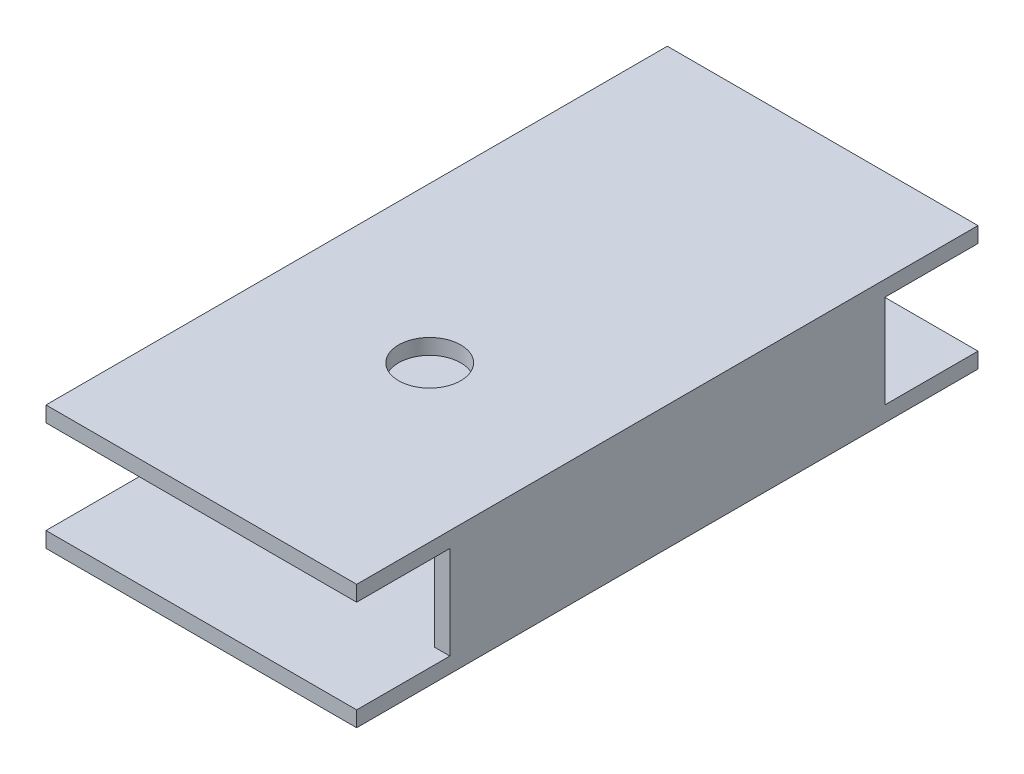
ISO-10303-21;
HEADER;
FILE_DESCRIPTION(('STEP AP214'),'2;1');
FILE_NAME('part.step','',(''),(''),'','','');
FILE_SCHEMA(('AUTOMOTIVE_DESIGN { 1 0 10303 214 1 1 1 1 }'));
ENDSEC;
DATA;
#1=APPLICATION_CONTEXT('core data for automotive mechanical design processes');
#2=APPLICATION_PROTOCOL_DEFINITION('international standard','automotive_design',2000,#1);
#3=PRODUCT_CONTEXT('',#1,'mechanical');
#4=PRODUCT('Part','Part','',(#3));
#5=PRODUCT_RELATED_PRODUCT_CATEGORY('part','',(#4));
#6=PRODUCT_DEFINITION_FORMATION('','',#4);
#7=PRODUCT_DEFINITION_CONTEXT('part definition',#1,'design');
#8=PRODUCT_DEFINITION('design','',#6,#7);
#9=PRODUCT_DEFINITION_SHAPE('','',#8);
#10=(LENGTH_UNIT() NAMED_UNIT(*) SI_UNIT(.MILLI.,.METRE.));
#11=(NAMED_UNIT(*) PLANE_ANGLE_UNIT() SI_UNIT($,.RADIAN.));
#12=(NAMED_UNIT(*) SI_UNIT($,.STERADIAN.) SOLID_ANGLE_UNIT());
#13=UNCERTAINTY_MEASURE_WITH_UNIT(LENGTH_MEASURE(1.E-05),#10,'distance_accuracy_value','');
#14=(GEOMETRIC_REPRESENTATION_CONTEXT(3) GLOBAL_UNCERTAINTY_ASSIGNED_CONTEXT((#13)) GLOBAL_UNIT_ASSIGNED_CONTEXT((#10,
#11,#12)) REPRESENTATION_CONTEXT('',''));
#15=CARTESIAN_POINT('',(0.,0.,0.));
#16=DIRECTION('',(0.,0.,1.));
#17=DIRECTION('',(1.,0.,0.));
#18=AXIS2_PLACEMENT_3D('',#15,#16,#17);
#19=CARTESIAN_POINT('',(0.,0.,127.));
#20=DIRECTION('',(0.,0.,1.));
#21=DIRECTION('',(1.,0.,0.));
#22=AXIS2_PLACEMENT_3D('',#19,#20,#21);
#23=PLANE('',#22);
#24=DIRECTION('',(-1.,0.,0.));
#25=VECTOR('',#24,1.);
#26=CARTESIAN_POINT('',(0.,22.225,127.));
#27=LINE('',#26,#25);
#28=CARTESIAN_POINT('',(63.5,22.225,127.));
#29=VERTEX_POINT('',#28);
#30=CARTESIAN_POINT('',(0.,22.225,127.));
#31=VERTEX_POINT('',#30);
#32=EDGE_CURVE('E180',#29,#31,#27,.T.);
#33=ORIENTED_EDGE('',*,*,#32,.F.);
#34=DIRECTION('',(0.,1.,0.));
#35=VECTOR('',#34,1.);
#36=CARTESIAN_POINT('',(63.5,0.,127.));
#37=LINE('',#36,#35);
#38=CARTESIAN_POINT('',(63.5,25.4,127.));
#39=VERTEX_POINT('',#38);
#40=EDGE_CURVE('E207',#29,#39,#37,.T.);
#41=ORIENTED_EDGE('',*,*,#40,.T.);
#42=DIRECTION('',(-1.,0.,0.));
#43=VECTOR('',#42,1.);
#44=CARTESIAN_POINT('',(0.,25.4,127.));
#45=LINE('',#44,#43);
#46=CARTESIAN_POINT('',(0.,25.4,127.));
#47=VERTEX_POINT('',#46);
#48=EDGE_CURVE('E209',#39,#47,#45,.T.);
#49=ORIENTED_EDGE('',*,*,#48,.T.);
#50=DIRECTION('',(0.,-1.,0.));
#51=VECTOR('',#50,1.);
#52=CARTESIAN_POINT('',(0.,0.,127.));
#53=LINE('',#52,#51);
#54=EDGE_CURVE('E195',#47,#31,#53,.T.);
#55=ORIENTED_EDGE('',*,*,#54,.T.);
#56=EDGE_LOOP('',(#33,#41,#49,#55));
#57=FACE_BOUND('',#56,.T.);
#58=ADVANCED_FACE('F56',(#57),#23,.T.);
#59=CARTESIAN_POINT('',(0.,0.,0.));
#60=DIRECTION('',(0.,0.,1.));
#61=DIRECTION('',(1.,0.,0.));
#62=AXIS2_PLACEMENT_3D('',#59,#60,#61);
#63=PLANE('',#62);
#64=DIRECTION('',(0.,-1.,0.));
#65=VECTOR('',#64,1.);
#66=CARTESIAN_POINT('',(0.,0.,0.));
#67=LINE('',#66,#65);
#68=CARTESIAN_POINT('',(0.,3.175,0.));
#69=VERTEX_POINT('',#68);
#70=CARTESIAN_POINT('',(0.,0.,0.));
#71=VERTEX_POINT('',#70);
#72=EDGE_CURVE('E216',#69,#71,#67,.T.);
#73=ORIENTED_EDGE('',*,*,#72,.F.);
#74=DIRECTION('',(1.,0.,0.));
#75=VECTOR('',#74,1.);
#76=CARTESIAN_POINT('',(0.,3.175,0.));
#77=LINE('',#76,#75);
#78=CARTESIAN_POINT('',(63.5,3.175,0.));
#79=VERTEX_POINT('',#78);
#80=EDGE_CURVE('E238',#69,#79,#77,.T.);
#81=ORIENTED_EDGE('',*,*,#80,.T.);
#82=DIRECTION('',(0.,1.,0.));
#83=VECTOR('',#82,1.);
#84=CARTESIAN_POINT('',(63.5,0.,0.));
#85=LINE('',#84,#83);
#86=CARTESIAN_POINT('',(63.5,0.,0.));
#87=VERTEX_POINT('',#86);
#88=EDGE_CURVE('E200',#87,#79,#85,.T.);
#89=ORIENTED_EDGE('',*,*,#88,.F.);
#90=DIRECTION('',(1.,0.,0.));
#91=VECTOR('',#90,1.);
#92=CARTESIAN_POINT('',(0.,0.,0.));
#93=LINE('',#92,#91);
#94=EDGE_CURVE('E215',#71,#87,#93,.T.);
#95=ORIENTED_EDGE('',*,*,#94,.F.);
#96=EDGE_LOOP('',(#73,#81,#89,#95));
#97=FACE_BOUND('',#96,.T.);
#98=ADVANCED_FACE('F237',(#97),#63,.F.);
#99=DIRECTION('',(1.,0.,0.));
#100=VECTOR('',#99,1.);
#101=CARTESIAN_POINT('',(0.,3.175,127.));
#102=LINE('',#101,#100);
#103=CARTESIAN_POINT('',(0.,3.175,127.));
#104=VERTEX_POINT('',#103);
#105=CARTESIAN_POINT('',(63.5,3.175,127.));
#106=VERTEX_POINT('',#105);
#107=EDGE_CURVE('E171',#104,#106,#102,.T.);
#108=ORIENTED_EDGE('',*,*,#107,.F.);
#109=CARTESIAN_POINT('',(0.,0.,127.));
#110=VERTEX_POINT('',#109);
#111=EDGE_CURVE('E175',#104,#110,#53,.T.);
#112=ORIENTED_EDGE('',*,*,#111,.T.);
#113=DIRECTION('',(1.,0.,0.));
#114=VECTOR('',#113,1.);
#115=CARTESIAN_POINT('',(0.,0.,127.));
#116=LINE('',#115,#114);
#117=CARTESIAN_POINT('',(63.5,0.,127.));
#118=VERTEX_POINT('',#117);
#119=EDGE_CURVE('E199',#110,#118,#116,.T.);
#120=ORIENTED_EDGE('',*,*,#119,.T.);
#121=EDGE_CURVE('E178',#118,#106,#37,.T.);
#122=ORIENTED_EDGE('',*,*,#121,.T.);
#123=EDGE_LOOP('',(#108,#112,#120,#122));
#124=FACE_BOUND('',#123,.T.);
#125=ADVANCED_FACE('F173',(#124),#23,.T.);
#126=CARTESIAN_POINT('',(63.5,22.225,0.));
#127=VERTEX_POINT('',#126);
#128=CARTESIAN_POINT('',(63.5,25.4,0.));
#129=VERTEX_POINT('',#128);
#130=EDGE_CURVE('E218',#127,#129,#85,.T.);
#131=ORIENTED_EDGE('',*,*,#130,.F.);
#132=DIRECTION('',(-1.,0.,0.));
#133=VECTOR('',#132,1.);
#134=CARTESIAN_POINT('',(0.,22.225,0.));
#135=LINE('',#134,#133);
#136=CARTESIAN_POINT('',(0.,22.225,0.));
#137=VERTEX_POINT('',#136);
#138=EDGE_CURVE('E181',#127,#137,#135,.T.);
#139=ORIENTED_EDGE('',*,*,#138,.T.);
#140=CARTESIAN_POINT('',(0.,25.4,0.));
#141=VERTEX_POINT('',#140);
#142=EDGE_CURVE('E212',#141,#137,#67,.T.);
#143=ORIENTED_EDGE('',*,*,#142,.F.);
#144=DIRECTION('',(-1.,0.,0.));
#145=VECTOR('',#144,1.);
#146=CARTESIAN_POINT('',(0.,25.4,0.));
#147=LINE('',#146,#145);
#148=EDGE_CURVE('E196',#129,#141,#147,.T.);
#149=ORIENTED_EDGE('',*,*,#148,.F.);
#150=EDGE_LOOP('',(#131,#139,#143,#149));
#151=FACE_BOUND('',#150,.T.);
#152=ADVANCED_FACE('F348',(#151),#63,.F.);
#153=CARTESIAN_POINT('',(0.,0.,127.));
#154=DIRECTION('',(1.,0.,0.));
#155=DIRECTION('',(0.,0.,-1.));
#156=AXIS2_PLACEMENT_3D('',#153,#154,#155);
#157=PLANE('',#156);
#158=DIRECTION('',(0.,1.,0.));
#159=VECTOR('',#158,1.);
#160=CARTESIAN_POINT('',(0.,22.225,107.95));
#161=LINE('',#160,#159);
#162=CARTESIAN_POINT('',(0.,3.175,107.95));
#163=VERTEX_POINT('',#162);
#164=CARTESIAN_POINT('',(0.,22.225,107.95));
#165=VERTEX_POINT('',#164);
#166=EDGE_CURVE('E191',#163,#165,#161,.T.);
#167=ORIENTED_EDGE('',*,*,#166,.T.);
#168=DIRECTION('',(0.,0.,1.));
#169=VECTOR('',#168,1.);
#170=CARTESIAN_POINT('',(0.,22.225,127.));
#171=LINE('',#170,#169);
#172=EDGE_CURVE('E307',#165,#31,#171,.T.);
#173=ORIENTED_EDGE('',*,*,#172,.T.);
#174=ORIENTED_EDGE('',*,*,#54,.F.);
#175=DIRECTION('',(0.,0.,-1.));
#176=VECTOR('',#175,1.);
#177=CARTESIAN_POINT('',(0.,25.4,127.));
#178=LINE('',#177,#176);
#179=EDGE_CURVE('E211',#47,#141,#178,.T.);
#180=ORIENTED_EDGE('',*,*,#179,.T.);
#181=ORIENTED_EDGE('',*,*,#142,.T.);
#182=DIRECTION('',(0.,0.,1.));
#183=VECTOR('',#182,1.);
#184=CARTESIAN_POINT('',(0.,22.225,0.));
#185=LINE('',#184,#183);
#186=CARTESIAN_POINT('',(0.,22.225,19.05));
#187=VERTEX_POINT('',#186);
#188=EDGE_CURVE('E249',#137,#187,#185,.T.);
#189=ORIENTED_EDGE('',*,*,#188,.T.);
#190=DIRECTION('',(0.,-1.,0.));
#191=VECTOR('',#190,1.);
#192=CARTESIAN_POINT('',(0.,22.225,19.05));
#193=LINE('',#192,#191);
#194=CARTESIAN_POINT('',(0.,3.175,19.05));
#195=VERTEX_POINT('',#194);
#196=EDGE_CURVE('E253',#187,#195,#193,.T.);
#197=ORIENTED_EDGE('',*,*,#196,.T.);
#198=DIRECTION('',(0.,0.,-1.));
#199=VECTOR('',#198,1.);
#200=CARTESIAN_POINT('',(0.,3.175,0.));
#201=LINE('',#200,#199);
#202=EDGE_CURVE('E281',#195,#69,#201,.T.);
#203=ORIENTED_EDGE('',*,*,#202,.T.);
#204=ORIENTED_EDGE('',*,*,#72,.T.);
#205=DIRECTION('',(0.,0.,-1.));
#206=VECTOR('',#205,1.);
#207=CARTESIAN_POINT('',(0.,0.,127.));
#208=LINE('',#207,#206);
#209=EDGE_CURVE('E12',#110,#71,#208,.T.);
#210=ORIENTED_EDGE('',*,*,#209,.F.);
#211=ORIENTED_EDGE('',*,*,#111,.F.);
#212=DIRECTION('',(0.,0.,-1.));
#213=VECTOR('',#212,1.);
#214=CARTESIAN_POINT('',(0.,3.175,127.));
#215=LINE('',#214,#213);
#216=EDGE_CURVE('E184',#104,#163,#215,.T.);
#217=ORIENTED_EDGE('',*,*,#216,.T.);
#218=EDGE_LOOP('',(#167,#173,#174,#180,#181,#189,#197,#203,#204,#210,#211,#217));
#219=FACE_BOUND('',#218,.T.);
#220=ADVANCED_FACE('F58',(#219),#157,.F.);
#221=CARTESIAN_POINT('',(0.,0.,127.));
#222=DIRECTION('',(0.,1.,0.));
#223=DIRECTION('',(0.,0.,1.));
#224=AXIS2_PLACEMENT_3D('',#221,#222,#223);
#225=PLANE('',#224);
#226=CARTESIAN_POINT('',(31.75,0.,80.3275));
#227=DIRECTION('',(0.,1.,0.));
#228=DIRECTION('',(0.,0.,1.));
#229=AXIS2_PLACEMENT_3D('',#226,#227,#228);
#230=CIRCLE('',#229,6.35);
#231=CARTESIAN_POINT('',(31.75,0.,86.6775));
#232=VERTEX_POINT('',#231);
#233=EDGE_CURVE('E316',#232,#232,#230,.T.);
#234=ORIENTED_EDGE('',*,*,#233,.T.);
#235=EDGE_LOOP('',(#234));
#236=FACE_BOUND('',#235,.T.);
#237=ORIENTED_EDGE('',*,*,#94,.T.);
#238=DIRECTION('',(0.,0.,-1.));
#239=VECTOR('',#238,1.);
#240=CARTESIAN_POINT('',(63.5,0.,127.));
#241=LINE('',#240,#239);
#242=EDGE_CURVE('E65',#118,#87,#241,.T.);
#243=ORIENTED_EDGE('',*,*,#242,.F.);
#244=ORIENTED_EDGE('',*,*,#119,.F.);
#245=ORIENTED_EDGE('',*,*,#209,.T.);
#246=EDGE_LOOP('',(#237,#243,#244,#245));
#247=FACE_BOUND('',#246,.T.);
#248=ADVANCED_FACE('F379',(#236,#247),#225,.F.);
#249=CARTESIAN_POINT('',(63.5,0.,127.));
#250=DIRECTION('',(-1.,0.,0.));
#251=DIRECTION('',(0.,0.,1.));
#252=AXIS2_PLACEMENT_3D('',#249,#250,#251);
#253=PLANE('',#252);
#254=ORIENTED_EDGE('',*,*,#40,.F.);
#255=DIRECTION('',(0.,0.,1.));
#256=VECTOR('',#255,1.);
#257=CARTESIAN_POINT('',(63.5,22.225,127.));
#258=LINE('',#257,#256);
#259=CARTESIAN_POINT('',(63.5,22.225,107.95));
#260=VERTEX_POINT('',#259);
#261=EDGE_CURVE('E192',#260,#29,#258,.T.);
#262=ORIENTED_EDGE('',*,*,#261,.F.);
#263=DIRECTION('',(0.,1.,0.));
#264=VECTOR('',#263,1.);
#265=CARTESIAN_POINT('',(63.5,22.225,107.95));
#266=LINE('',#265,#264);
#267=CARTESIAN_POINT('',(63.5,3.175,107.95));
#268=VERTEX_POINT('',#267);
#269=EDGE_CURVE('E301',#268,#260,#266,.T.);
#270=ORIENTED_EDGE('',*,*,#269,.F.);
#271=DIRECTION('',(0.,0.,-1.));
#272=VECTOR('',#271,1.);
#273=CARTESIAN_POINT('',(63.5,3.175,127.));
#274=LINE('',#273,#272);
#275=EDGE_CURVE('E304',#106,#268,#274,.T.);
#276=ORIENTED_EDGE('',*,*,#275,.F.);
#277=ORIENTED_EDGE('',*,*,#121,.F.);
#278=ORIENTED_EDGE('',*,*,#242,.T.);
#279=ORIENTED_EDGE('',*,*,#88,.T.);
#280=DIRECTION('',(0.,0.,-1.));
#281=VECTOR('',#280,1.);
#282=CARTESIAN_POINT('',(63.5,3.175,0.));
#283=LINE('',#282,#281);
#284=CARTESIAN_POINT('',(63.5,3.175,19.05));
#285=VERTEX_POINT('',#284);
#286=EDGE_CURVE('E244',#285,#79,#283,.T.);
#287=ORIENTED_EDGE('',*,*,#286,.F.);
#288=DIRECTION('',(0.,-1.,0.));
#289=VECTOR('',#288,1.);
#290=CARTESIAN_POINT('',(63.5,22.225,19.05));
#291=LINE('',#290,#289);
#292=CARTESIAN_POINT('',(63.5,22.225,19.05));
#293=VERTEX_POINT('',#292);
#294=EDGE_CURVE('E250',#293,#285,#291,.T.);
#295=ORIENTED_EDGE('',*,*,#294,.F.);
#296=DIRECTION('',(0.,0.,1.));
#297=VECTOR('',#296,1.);
#298=CARTESIAN_POINT('',(63.5,22.225,0.));
#299=LINE('',#298,#297);
#300=EDGE_CURVE('E255',#127,#293,#299,.T.);
#301=ORIENTED_EDGE('',*,*,#300,.F.);
#302=ORIENTED_EDGE('',*,*,#130,.T.);
#303=DIRECTION('',(0.,0.,-1.));
#304=VECTOR('',#303,1.);
#305=CARTESIAN_POINT('',(63.5,25.4,127.));
#306=LINE('',#305,#304);
#307=EDGE_CURVE('E223',#39,#129,#306,.T.);
#308=ORIENTED_EDGE('',*,*,#307,.F.);
#309=EDGE_LOOP('',(#254,#262,#270,#276,#277,#278,#279,#287,#295,#301,#302,#308));
#310=FACE_BOUND('',#309,.T.);
#311=ADVANCED_FACE('F231',(#310),#253,.F.);
#312=CARTESIAN_POINT('',(0.,25.4,127.));
#313=DIRECTION('',(0.,-1.,0.));
#314=DIRECTION('',(0.,0.,-1.));
#315=AXIS2_PLACEMENT_3D('',#312,#313,#314);
#316=PLANE('',#315);
#317=CARTESIAN_POINT('',(31.75,25.4,80.3275));
#318=DIRECTION('',(0.,1.,0.));
#319=DIRECTION('',(0.,0.,1.));
#320=AXIS2_PLACEMENT_3D('',#317,#318,#319);
#321=CIRCLE('',#320,6.35);
#322=CARTESIAN_POINT('',(31.75,25.4,86.6775));
#323=VERTEX_POINT('',#322);
#324=EDGE_CURVE('E313',#323,#323,#321,.T.);
#325=ORIENTED_EDGE('',*,*,#324,.F.);
#326=EDGE_LOOP('',(#325));
#327=FACE_BOUND('',#326,.T.);
#328=ORIENTED_EDGE('',*,*,#148,.T.);
#329=ORIENTED_EDGE('',*,*,#179,.F.);
#330=ORIENTED_EDGE('',*,*,#48,.F.);
#331=ORIENTED_EDGE('',*,*,#307,.T.);
#332=EDGE_LOOP('',(#328,#329,#330,#331));
#333=FACE_BOUND('',#332,.T.);
#334=ADVANCED_FACE('F343',(#327,#333),#316,.F.);
#335=CARTESIAN_POINT('',(3.175,0.,127.));
#336=DIRECTION('',(1.,0.,0.));
#337=DIRECTION('',(0.,0.,-1.));
#338=AXIS2_PLACEMENT_3D('',#335,#336,#337);
#339=PLANE('',#338);
#340=DIRECTION('',(0.,1.,0.));
#341=VECTOR('',#340,1.);
#342=CARTESIAN_POINT('',(3.175,0.,107.95));
#343=LINE('',#342,#341);
#344=CARTESIAN_POINT('',(3.175,3.175,107.95));
#345=VERTEX_POINT('',#344);
#346=CARTESIAN_POINT('',(3.175,22.225,107.95));
#347=VERTEX_POINT('',#346);
#348=EDGE_CURVE('E286',#345,#347,#343,.T.);
#349=ORIENTED_EDGE('',*,*,#348,.F.);
#350=DIRECTION('',(0.,0.,-1.));
#351=VECTOR('',#350,1.);
#352=CARTESIAN_POINT('',(3.175,3.175,127.));
#353=LINE('',#352,#351);
#354=CARTESIAN_POINT('',(3.175,3.175,19.05));
#355=VERTEX_POINT('',#354);
#356=EDGE_CURVE('E204',#345,#355,#353,.T.);
#357=ORIENTED_EDGE('',*,*,#356,.T.);
#358=DIRECTION('',(0.,-1.,0.));
#359=VECTOR('',#358,1.);
#360=CARTESIAN_POINT('',(3.175,0.,19.05));
#361=LINE('',#360,#359);
#362=CARTESIAN_POINT('',(3.175,22.225,19.05));
#363=VERTEX_POINT('',#362);
#364=EDGE_CURVE('E242',#363,#355,#361,.T.);
#365=ORIENTED_EDGE('',*,*,#364,.F.);
#366=DIRECTION('',(0.,0.,-1.));
#367=VECTOR('',#366,1.);
#368=CARTESIAN_POINT('',(3.175,22.225,127.));
#369=LINE('',#368,#367);
#370=EDGE_CURVE('E271',#347,#363,#369,.T.);
#371=ORIENTED_EDGE('',*,*,#370,.F.);
#372=EDGE_LOOP('',(#349,#357,#365,#371));
#373=FACE_BOUND('',#372,.T.);
#374=ADVANCED_FACE('F353',(#373),#339,.T.);
#375=CARTESIAN_POINT('',(0.,3.175,127.));
#376=DIRECTION('',(0.,1.,0.));
#377=DIRECTION('',(0.,0.,1.));
#378=AXIS2_PLACEMENT_3D('',#375,#376,#377);
#379=PLANE('',#378);
#380=CARTESIAN_POINT('',(31.75,3.175,80.3275));
#381=DIRECTION('',(0.,1.,0.));
#382=DIRECTION('',(0.,0.,1.));
#383=AXIS2_PLACEMENT_3D('',#380,#381,#382);
#384=CIRCLE('',#383,6.35);
#385=CARTESIAN_POINT('',(31.75,3.175,86.6775));
#386=VERTEX_POINT('',#385);
#387=EDGE_CURVE('E306',#386,#386,#384,.T.);
#388=ORIENTED_EDGE('',*,*,#387,.F.);
#389=EDGE_LOOP('',(#388));
#390=FACE_BOUND('',#389,.T.);
#391=ORIENTED_EDGE('',*,*,#356,.F.);
#392=DIRECTION('',(1.,0.,0.));
#393=VECTOR('',#392,1.);
#394=CARTESIAN_POINT('',(0.,3.175,107.95));
#395=LINE('',#394,#393);
#396=EDGE_CURVE('E187',#163,#345,#395,.T.);
#397=ORIENTED_EDGE('',*,*,#396,.F.);
#398=ORIENTED_EDGE('',*,*,#216,.F.);
#399=ORIENTED_EDGE('',*,*,#107,.T.);
#400=ORIENTED_EDGE('',*,*,#275,.T.);
#401=CARTESIAN_POINT('',(60.325,3.175,107.95));
#402=VERTEX_POINT('',#401);
#403=EDGE_CURVE('E72',#402,#268,#395,.T.);
#404=ORIENTED_EDGE('',*,*,#403,.F.);
#405=DIRECTION('',(0.,0.,-1.));
#406=VECTOR('',#405,1.);
#407=CARTESIAN_POINT('',(60.325,3.175,127.));
#408=LINE('',#407,#406);
#409=CARTESIAN_POINT('',(60.325,3.175,19.05));
#410=VERTEX_POINT('',#409);
#411=EDGE_CURVE('E275',#402,#410,#408,.T.);
#412=ORIENTED_EDGE('',*,*,#411,.T.);
#413=DIRECTION('',(1.,0.,0.));
#414=VECTOR('',#413,1.);
#415=CARTESIAN_POINT('',(0.,3.175,19.05));
#416=LINE('',#415,#414);
#417=EDGE_CURVE('E246',#410,#285,#416,.T.);
#418=ORIENTED_EDGE('',*,*,#417,.T.);
#419=ORIENTED_EDGE('',*,*,#286,.T.);
#420=ORIENTED_EDGE('',*,*,#80,.F.);
#421=ORIENTED_EDGE('',*,*,#202,.F.);
#422=EDGE_CURVE('E259',#195,#355,#416,.T.);
#423=ORIENTED_EDGE('',*,*,#422,.T.);
#424=EDGE_LOOP('',(#391,#397,#398,#399,#400,#404,#412,#418,#419,#420,#421,#423));
#425=FACE_BOUND('',#424,.T.);
#426=ADVANCED_FACE('F186',(#390,#425),#379,.T.);
#427=CARTESIAN_POINT('',(60.325,0.,127.));
#428=DIRECTION('',(-1.,0.,0.));
#429=DIRECTION('',(0.,0.,1.));
#430=AXIS2_PLACEMENT_3D('',#427,#428,#429);
#431=PLANE('',#430);
#432=DIRECTION('',(0.,-1.,0.));
#433=VECTOR('',#432,1.);
#434=CARTESIAN_POINT('',(60.325,0.,107.95));
#435=LINE('',#434,#433);
#436=CARTESIAN_POINT('',(60.325,22.225,107.95));
#437=VERTEX_POINT('',#436);
#438=EDGE_CURVE('E289',#437,#402,#435,.T.);
#439=ORIENTED_EDGE('',*,*,#438,.F.);
#440=DIRECTION('',(0.,0.,-1.));
#441=VECTOR('',#440,1.);
#442=CARTESIAN_POINT('',(60.325,22.225,127.));
#443=LINE('',#442,#441);
#444=CARTESIAN_POINT('',(60.325,22.225,19.05));
#445=VERTEX_POINT('',#444);
#446=EDGE_CURVE('E80',#437,#445,#443,.T.);
#447=ORIENTED_EDGE('',*,*,#446,.T.);
#448=DIRECTION('',(0.,1.,0.));
#449=VECTOR('',#448,1.);
#450=CARTESIAN_POINT('',(60.325,0.,19.05));
#451=LINE('',#450,#449);
#452=EDGE_CURVE('E262',#410,#445,#451,.T.);
#453=ORIENTED_EDGE('',*,*,#452,.F.);
#454=ORIENTED_EDGE('',*,*,#411,.F.);
#455=EDGE_LOOP('',(#439,#447,#453,#454));
#456=FACE_BOUND('',#455,.T.);
#457=ADVANCED_FACE('F329',(#456),#431,.T.);
#458=CARTESIAN_POINT('',(0.,22.225,127.));
#459=DIRECTION('',(0.,-1.,0.));
#460=DIRECTION('',(0.,0.,-1.));
#461=AXIS2_PLACEMENT_3D('',#458,#459,#460);
#462=PLANE('',#461);
#463=CARTESIAN_POINT('',(31.75,22.225,80.3275));
#464=DIRECTION('',(0.,-1.,0.));
#465=DIRECTION('',(0.,0.,-1.));
#466=AXIS2_PLACEMENT_3D('',#463,#464,#465);
#467=CIRCLE('',#466,6.35);
#468=CARTESIAN_POINT('',(31.75,22.225,73.9775));
#469=VERTEX_POINT('',#468);
#470=EDGE_CURVE('E60',#469,#469,#467,.T.);
#471=ORIENTED_EDGE('',*,*,#470,.F.);
#472=EDGE_LOOP('',(#471));
#473=FACE_BOUND('',#472,.T.);
#474=ORIENTED_EDGE('',*,*,#446,.F.);
#475=DIRECTION('',(1.,0.,0.));
#476=VECTOR('',#475,1.);
#477=CARTESIAN_POINT('',(0.,22.225,107.95));
#478=LINE('',#477,#476);
#479=EDGE_CURVE('E297',#437,#260,#478,.T.);
#480=ORIENTED_EDGE('',*,*,#479,.T.);
#481=ORIENTED_EDGE('',*,*,#261,.T.);
#482=ORIENTED_EDGE('',*,*,#32,.T.);
#483=ORIENTED_EDGE('',*,*,#172,.F.);
#484=EDGE_CURVE('E293',#165,#347,#478,.T.);
#485=ORIENTED_EDGE('',*,*,#484,.T.);
#486=ORIENTED_EDGE('',*,*,#370,.T.);
#487=DIRECTION('',(1.,0.,0.));
#488=VECTOR('',#487,1.);
#489=CARTESIAN_POINT('',(0.,22.225,19.05));
#490=LINE('',#489,#488);
#491=EDGE_CURVE('E263',#187,#363,#490,.T.);
#492=ORIENTED_EDGE('',*,*,#491,.F.);
#493=ORIENTED_EDGE('',*,*,#188,.F.);
#494=ORIENTED_EDGE('',*,*,#138,.F.);
#495=ORIENTED_EDGE('',*,*,#300,.T.);
#496=EDGE_CURVE('E266',#445,#293,#490,.T.);
#497=ORIENTED_EDGE('',*,*,#496,.F.);
#498=EDGE_LOOP('',(#474,#480,#481,#482,#483,#485,#486,#492,#493,#494,#495,#497));
#499=FACE_BOUND('',#498,.T.);
#500=ADVANCED_FACE('F326',(#473,#499),#462,.T.);
#501=CARTESIAN_POINT('',(0.,22.225,19.05));
#502=DIRECTION('',(0.,0.,1.));
#503=DIRECTION('',(1.,0.,0.));
#504=AXIS2_PLACEMENT_3D('',#501,#502,#503);
#505=PLANE('',#504);
#506=ORIENTED_EDGE('',*,*,#452,.T.);
#507=ORIENTED_EDGE('',*,*,#496,.T.);
#508=ORIENTED_EDGE('',*,*,#294,.T.);
#509=ORIENTED_EDGE('',*,*,#417,.F.);
#510=EDGE_LOOP('',(#506,#507,#508,#509));
#511=FACE_BOUND('',#510,.T.);
#512=ADVANCED_FACE('F328',(#511),#505,.F.);
#513=ORIENTED_EDGE('',*,*,#364,.T.);
#514=ORIENTED_EDGE('',*,*,#422,.F.);
#515=ORIENTED_EDGE('',*,*,#196,.F.);
#516=ORIENTED_EDGE('',*,*,#491,.T.);
#517=EDGE_LOOP('',(#513,#514,#515,#516));
#518=FACE_BOUND('',#517,.T.);
#519=ADVANCED_FACE('F352',(#518),#505,.F.);
#520=CARTESIAN_POINT('',(0.,22.225,107.95));
#521=DIRECTION('',(0.,0.,-1.));
#522=DIRECTION('',(-1.,0.,0.));
#523=AXIS2_PLACEMENT_3D('',#520,#521,#522);
#524=PLANE('',#523);
#525=ORIENTED_EDGE('',*,*,#438,.T.);
#526=ORIENTED_EDGE('',*,*,#403,.T.);
#527=ORIENTED_EDGE('',*,*,#269,.T.);
#528=ORIENTED_EDGE('',*,*,#479,.F.);
#529=EDGE_LOOP('',(#525,#526,#527,#528));
#530=FACE_BOUND('',#529,.T.);
#531=ADVANCED_FACE('F333',(#530),#524,.F.);
#532=ORIENTED_EDGE('',*,*,#348,.T.);
#533=ORIENTED_EDGE('',*,*,#484,.F.);
#534=ORIENTED_EDGE('',*,*,#166,.F.);
#535=ORIENTED_EDGE('',*,*,#396,.T.);
#536=EDGE_LOOP('',(#532,#533,#534,#535));
#537=FACE_BOUND('',#536,.T.);
#538=ADVANCED_FACE('F388',(#537),#524,.F.);
#539=CARTESIAN_POINT('',(31.75,0.,80.3275));
#540=DIRECTION('',(0.,1.,0.));
#541=DIRECTION('',(0.,0.,1.));
#542=AXIS2_PLACEMENT_3D('',#539,#540,#541);
#543=CYLINDRICAL_SURFACE('',#542,6.35);
#544=ORIENTED_EDGE('',*,*,#470,.T.);
#545=EDGE_LOOP('',(#544));
#546=FACE_BOUND('',#545,.T.);
#547=ORIENTED_EDGE('',*,*,#324,.T.);
#548=EDGE_LOOP('',(#547));
#549=FACE_BOUND('',#548,.T.);
#550=ADVANCED_FACE('F323',(#546,#549),#543,.F.);
#551=ORIENTED_EDGE('',*,*,#387,.T.);
#552=EDGE_LOOP('',(#551));
#553=FACE_BOUND('',#552,.T.);
#554=ORIENTED_EDGE('',*,*,#233,.F.);
#555=EDGE_LOOP('',(#554));
#556=FACE_BOUND('',#555,.T.);
#557=ADVANCED_FACE('F410',(#553,#556),#543,.F.);
#558=CLOSED_SHELL('',(#58,#98,#125,#152,#220,#248,#311,#334,#374,#426,#457,#500,#512,#519,#531,
#538,#550,#557));
#559=MANIFOLD_SOLID_BREP('B2',#558);
#560=ADVANCED_BREP_SHAPE_REPRESENTATION('',(#18,#559),#14);
#561=SHAPE_DEFINITION_REPRESENTATION(#9,#560);
ENDSEC;
END-ISO-10303-21;
